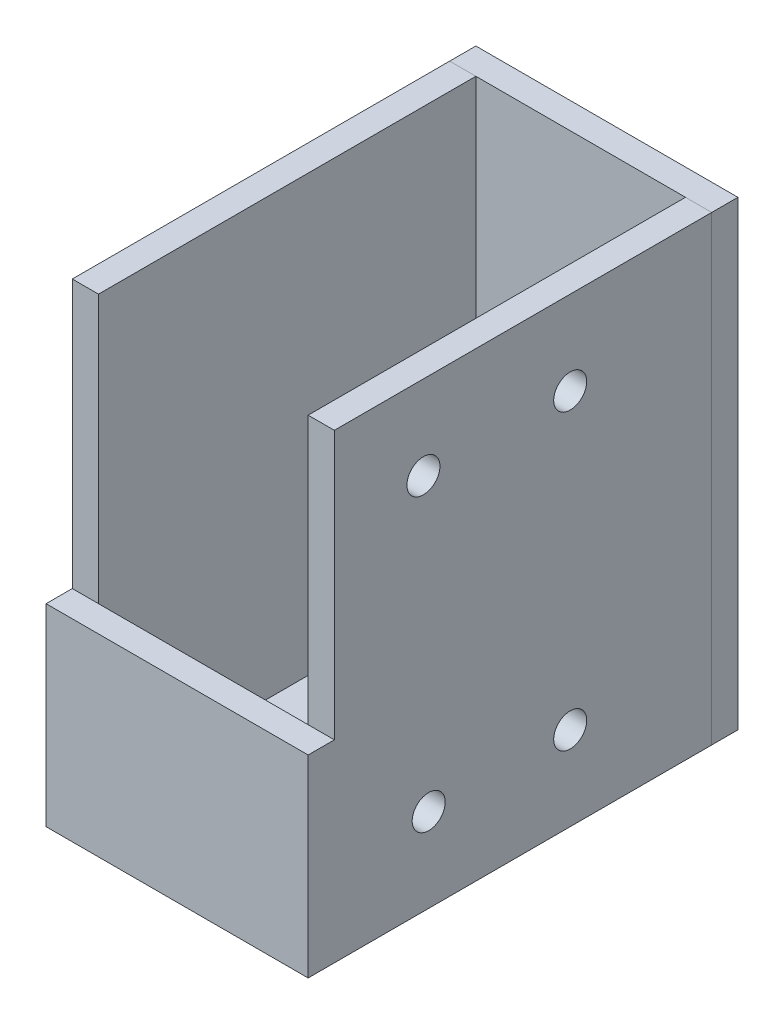
ISO-10303-21;
HEADER;
FILE_DESCRIPTION(('STEP AP214'),'2;1');
FILE_NAME('part.step','',(''),(''),'','','');
FILE_SCHEMA(('AUTOMOTIVE_DESIGN { 1 0 10303 214 1 1 1 1 }'));
ENDSEC;
DATA;
#1=APPLICATION_CONTEXT('core data for automotive mechanical design processes');
#2=APPLICATION_PROTOCOL_DEFINITION('international standard','automotive_design',2000,#1);
#3=PRODUCT_CONTEXT('',#1,'mechanical');
#4=PRODUCT('Part','Part','',(#3));
#5=PRODUCT_RELATED_PRODUCT_CATEGORY('part','',(#4));
#6=PRODUCT_DEFINITION_FORMATION('','',#4);
#7=PRODUCT_DEFINITION_CONTEXT('part definition',#1,'design');
#8=PRODUCT_DEFINITION('design','',#6,#7);
#9=PRODUCT_DEFINITION_SHAPE('','',#8);
#10=(LENGTH_UNIT() NAMED_UNIT(*) SI_UNIT(.MILLI.,.METRE.));
#11=(NAMED_UNIT(*) PLANE_ANGLE_UNIT() SI_UNIT($,.RADIAN.));
#12=(NAMED_UNIT(*) SI_UNIT($,.STERADIAN.) SOLID_ANGLE_UNIT());
#13=UNCERTAINTY_MEASURE_WITH_UNIT(LENGTH_MEASURE(1.E-05),#10,'distance_accuracy_value','');
#14=(GEOMETRIC_REPRESENTATION_CONTEXT(3) GLOBAL_UNCERTAINTY_ASSIGNED_CONTEXT((#13)) GLOBAL_UNIT_ASSIGNED_CONTEXT((#10,
#11,#12)) REPRESENTATION_CONTEXT('',''));
#15=CARTESIAN_POINT('',(0.,0.,0.));
#16=DIRECTION('',(0.,0.,1.));
#17=DIRECTION('',(1.,0.,0.));
#18=AXIS2_PLACEMENT_3D('',#15,#16,#17);
#19=CARTESIAN_POINT('',(0.,55.88,-3.175));
#20=DIRECTION('',(0.,-1.,0.));
#21=DIRECTION('',(0.,0.,-1.));
#22=AXIS2_PLACEMENT_3D('',#19,#20,#21);
#23=PLANE('',#22);
#24=DIRECTION('',(1.,0.,0.));
#25=VECTOR('',#24,1.);
#26=CARTESIAN_POINT('',(0.,55.88,0.));
#27=LINE('',#26,#25);
#28=CARTESIAN_POINT('',(0.,55.88,0.));
#29=VERTEX_POINT('',#28);
#30=CARTESIAN_POINT('',(31.75,55.88,0.));
#31=VERTEX_POINT('',#30);
#32=EDGE_CURVE('E118',#29,#31,#27,.T.);
#33=ORIENTED_EDGE('',*,*,#32,.T.);
#34=DIRECTION('',(0.,0.,1.));
#35=VECTOR('',#34,1.);
#36=CARTESIAN_POINT('',(31.75,55.88,-3.175));
#37=LINE('',#36,#35);
#38=CARTESIAN_POINT('',(31.75,55.88,-3.175));
#39=VERTEX_POINT('',#38);
#40=EDGE_CURVE('E12',#39,#31,#37,.T.);
#41=ORIENTED_EDGE('',*,*,#40,.F.);
#42=DIRECTION('',(1.,0.,0.));
#43=VECTOR('',#42,1.);
#44=CARTESIAN_POINT('',(0.,55.88,-3.175));
#45=LINE('',#44,#43);
#46=CARTESIAN_POINT('',(0.,55.88,-3.175));
#47=VERTEX_POINT('',#46);
#48=EDGE_CURVE('E106',#47,#39,#45,.T.);
#49=ORIENTED_EDGE('',*,*,#48,.F.);
#50=DIRECTION('',(0.,0.,1.));
#51=VECTOR('',#50,1.);
#52=CARTESIAN_POINT('',(0.,55.88,-3.175));
#53=LINE('',#52,#51);
#54=EDGE_CURVE('E114',#47,#29,#53,.T.);
#55=ORIENTED_EDGE('',*,*,#54,.T.);
#56=EDGE_LOOP('',(#33,#41,#49,#55));
#57=FACE_BOUND('',#56,.T.);
#58=ADVANCED_FACE('F55',(#57),#23,.F.);
#59=CARTESIAN_POINT('',(31.75,55.88,-3.175));
#60=DIRECTION('',(-1.,0.,0.));
#61=DIRECTION('',(0.,-1.,0.));
#62=AXIS2_PLACEMENT_3D('',#59,#60,#61);
#63=PLANE('',#62);
#64=DIRECTION('',(0.,-1.,0.));
#65=VECTOR('',#64,1.);
#66=CARTESIAN_POINT('',(31.75,55.88,0.));
#67=LINE('',#66,#65);
#68=CARTESIAN_POINT('',(31.75,0.,0.));
#69=VERTEX_POINT('',#68);
#70=EDGE_CURVE('E110',#31,#69,#67,.T.);
#71=ORIENTED_EDGE('',*,*,#70,.T.);
#72=DIRECTION('',(0.,0.,1.));
#73=VECTOR('',#72,1.);
#74=CARTESIAN_POINT('',(31.75,0.,-3.175));
#75=LINE('',#74,#73);
#76=CARTESIAN_POINT('',(31.75,0.,-3.175));
#77=VERTEX_POINT('',#76);
#78=EDGE_CURVE('E63',#77,#69,#75,.T.);
#79=ORIENTED_EDGE('',*,*,#78,.F.);
#80=DIRECTION('',(0.,-1.,0.));
#81=VECTOR('',#80,1.);
#82=CARTESIAN_POINT('',(31.75,55.88,-3.175));
#83=LINE('',#82,#81);
#84=EDGE_CURVE('E101',#39,#77,#83,.T.);
#85=ORIENTED_EDGE('',*,*,#84,.F.);
#86=ORIENTED_EDGE('',*,*,#40,.T.);
#87=EDGE_LOOP('',(#71,#79,#85,#86));
#88=FACE_BOUND('',#87,.T.);
#89=ADVANCED_FACE('F109',(#88),#63,.F.);
#90=CARTESIAN_POINT('',(31.75,0.,-3.175));
#91=DIRECTION('',(0.,1.,0.));
#92=DIRECTION('',(-1.,0.,0.));
#93=AXIS2_PLACEMENT_3D('',#90,#91,#92);
#94=PLANE('',#93);
#95=DIRECTION('',(-1.,0.,0.));
#96=VECTOR('',#95,1.);
#97=CARTESIAN_POINT('',(31.75,0.,0.));
#98=LINE('',#97,#96);
#99=CARTESIAN_POINT('',(0.,0.,0.));
#100=VERTEX_POINT('',#99);
#101=EDGE_CURVE('E88',#69,#100,#98,.T.);
#102=ORIENTED_EDGE('',*,*,#101,.T.);
#103=DIRECTION('',(0.,0.,1.));
#104=VECTOR('',#103,1.);
#105=CARTESIAN_POINT('',(0.,0.,-3.175));
#106=LINE('',#105,#104);
#107=CARTESIAN_POINT('',(0.,0.,-3.175));
#108=VERTEX_POINT('',#107);
#109=EDGE_CURVE('E111',#108,#100,#106,.T.);
#110=ORIENTED_EDGE('',*,*,#109,.F.);
#111=DIRECTION('',(-1.,0.,0.));
#112=VECTOR('',#111,1.);
#113=CARTESIAN_POINT('',(31.75,0.,-3.175));
#114=LINE('',#113,#112);
#115=EDGE_CURVE('E104',#77,#108,#114,.T.);
#116=ORIENTED_EDGE('',*,*,#115,.F.);
#117=ORIENTED_EDGE('',*,*,#78,.T.);
#118=EDGE_LOOP('',(#102,#110,#116,#117));
#119=FACE_BOUND('',#118,.T.);
#120=ADVANCED_FACE('F112',(#119),#94,.F.);
#121=CARTESIAN_POINT('',(0.,0.,-3.175));
#122=DIRECTION('',(1.,0.,0.));
#123=DIRECTION('',(0.,0.,-1.));
#124=AXIS2_PLACEMENT_3D('',#121,#122,#123);
#125=PLANE('',#124);
#126=DIRECTION('',(0.,1.,0.));
#127=VECTOR('',#126,1.);
#128=CARTESIAN_POINT('',(0.,0.,0.));
#129=LINE('',#128,#127);
#130=EDGE_CURVE('E94',#100,#29,#129,.T.);
#131=ORIENTED_EDGE('',*,*,#130,.T.);
#132=ORIENTED_EDGE('',*,*,#54,.F.);
#133=DIRECTION('',(0.,1.,0.));
#134=VECTOR('',#133,1.);
#135=CARTESIAN_POINT('',(0.,0.,-3.175));
#136=LINE('',#135,#134);
#137=EDGE_CURVE('E71',#108,#47,#136,.T.);
#138=ORIENTED_EDGE('',*,*,#137,.F.);
#139=ORIENTED_EDGE('',*,*,#109,.T.);
#140=EDGE_LOOP('',(#131,#132,#138,#139));
#141=FACE_BOUND('',#140,.T.);
#142=ADVANCED_FACE('F125',(#141),#125,.F.);
#143=CARTESIAN_POINT('',(0.,0.,-3.175));
#144=DIRECTION('',(0.,0.,-1.));
#145=DIRECTION('',(-1.,0.,0.));
#146=AXIS2_PLACEMENT_3D('',#143,#144,#145);
#147=PLANE('',#146);
#148=ORIENTED_EDGE('',*,*,#48,.T.);
#149=ORIENTED_EDGE('',*,*,#84,.T.);
#150=ORIENTED_EDGE('',*,*,#115,.T.);
#151=ORIENTED_EDGE('',*,*,#137,.T.);
#152=EDGE_LOOP('',(#148,#149,#150,#151));
#153=FACE_BOUND('',#152,.T.);
#154=ADVANCED_FACE('F102',(#153),#147,.T.);
#155=CARTESIAN_POINT('',(0.,0.,0.));
#156=DIRECTION('',(0.,0.,-1.));
#157=DIRECTION('',(-1.,0.,0.));
#158=AXIS2_PLACEMENT_3D('',#155,#156,#157);
#159=PLANE('',#158);
#160=ORIENTED_EDGE('',*,*,#32,.F.);
#161=ORIENTED_EDGE('',*,*,#130,.F.);
#162=ORIENTED_EDGE('',*,*,#101,.F.);
#163=ORIENTED_EDGE('',*,*,#70,.F.);
#164=EDGE_LOOP('',(#160,#161,#162,#163));
#165=FACE_BOUND('',#164,.T.);
#166=ADVANCED_FACE('F128',(#165),#159,.F.);
#167=CLOSED_SHELL('',(#58,#89,#120,#142,#154,#166));
#168=MANIFOLD_SOLID_BREP('B2',#167);
#169=CARTESIAN_POINT('',(0.,55.88,45.72));
#170=DIRECTION('',(0.,-1.,0.));
#171=DIRECTION('',(0.,0.,-1.));
#172=AXIS2_PLACEMENT_3D('',#169,#170,#171);
#173=PLANE('',#172);
#174=DIRECTION('',(-1.,0.,0.));
#175=VECTOR('',#174,1.);
#176=CARTESIAN_POINT('',(0.,55.88,45.72));
#177=LINE('',#176,#175);
#178=CARTESIAN_POINT('',(31.75,55.88,45.72));
#179=VERTEX_POINT('',#178);
#180=CARTESIAN_POINT('',(28.575,55.88,45.72));
#181=VERTEX_POINT('',#180);
#182=EDGE_CURVE('E313',#179,#181,#177,.T.);
#183=ORIENTED_EDGE('',*,*,#182,.F.);
#184=DIRECTION('',(0.,0.,-1.));
#185=VECTOR('',#184,1.);
#186=CARTESIAN_POINT('',(31.75,55.88,45.72));
#187=LINE('',#186,#185);
#188=CARTESIAN_POINT('',(31.75,55.88,0.));
#189=VERTEX_POINT('',#188);
#190=EDGE_CURVE('E188',#179,#189,#187,.T.);
#191=ORIENTED_EDGE('',*,*,#190,.T.);
#192=DIRECTION('',(-1.,0.,0.));
#193=VECTOR('',#192,1.);
#194=CARTESIAN_POINT('',(28.575,55.88,0.));
#195=LINE('',#194,#193);
#196=CARTESIAN_POINT('',(28.575,55.88,0.));
#197=VERTEX_POINT('',#196);
#198=EDGE_CURVE('E271',#189,#197,#195,.T.);
#199=ORIENTED_EDGE('',*,*,#198,.T.);
#200=DIRECTION('',(0.,0.,-1.));
#201=VECTOR('',#200,1.);
#202=CARTESIAN_POINT('',(28.575,55.88,45.72));
#203=LINE('',#202,#201);
#204=EDGE_CURVE('E303',#181,#197,#203,.T.);
#205=ORIENTED_EDGE('',*,*,#204,.F.);
#206=EDGE_LOOP('',(#183,#191,#199,#205));
#207=FACE_BOUND('',#206,.T.);
#208=ADVANCED_FACE('F179',(#207),#173,.F.);
#209=CARTESIAN_POINT('',(3.175,55.88,45.72));
#210=VERTEX_POINT('',#209);
#211=CARTESIAN_POINT('',(0.,55.88,45.72));
#212=VERTEX_POINT('',#211);
#213=EDGE_CURVE('E392',#210,#212,#177,.T.);
#214=ORIENTED_EDGE('',*,*,#213,.F.);
#215=DIRECTION('',(0.,0.,-1.));
#216=VECTOR('',#215,1.);
#217=CARTESIAN_POINT('',(3.175,55.88,45.72));
#218=LINE('',#217,#216);
#219=CARTESIAN_POINT('',(3.175,55.88,0.));
#220=VERTEX_POINT('',#219);
#221=EDGE_CURVE('E293',#210,#220,#218,.T.);
#222=ORIENTED_EDGE('',*,*,#221,.T.);
#223=DIRECTION('',(-1.,0.,0.));
#224=VECTOR('',#223,1.);
#225=CARTESIAN_POINT('',(0.,55.88,0.));
#226=LINE('',#225,#224);
#227=CARTESIAN_POINT('',(0.,55.88,0.));
#228=VERTEX_POINT('',#227);
#229=EDGE_CURVE('E251',#220,#228,#226,.T.);
#230=ORIENTED_EDGE('',*,*,#229,.T.);
#231=DIRECTION('',(0.,0.,-1.));
#232=VECTOR('',#231,1.);
#233=CARTESIAN_POINT('',(0.,55.88,45.72));
#234=LINE('',#233,#232);
#235=EDGE_CURVE('E244',#212,#228,#234,.T.);
#236=ORIENTED_EDGE('',*,*,#235,.F.);
#237=EDGE_LOOP('',(#214,#222,#230,#236));
#238=FACE_BOUND('',#237,.T.);
#239=ADVANCED_FACE('F446',(#238),#173,.F.);
#240=CARTESIAN_POINT('',(31.75,0.,45.72));
#241=DIRECTION('',(0.,1.,0.));
#242=DIRECTION('',(-1.,0.,0.));
#243=AXIS2_PLACEMENT_3D('',#240,#241,#242);
#244=PLANE('',#243);
#245=DIRECTION('',(1.,0.,0.));
#246=VECTOR('',#245,1.);
#247=CARTESIAN_POINT('',(31.75,0.,0.));
#248=LINE('',#247,#246);
#249=CARTESIAN_POINT('',(0.,0.,0.));
#250=VERTEX_POINT('',#249);
#251=CARTESIAN_POINT('',(31.75,0.,0.));
#252=VERTEX_POINT('',#251);
#253=EDGE_CURVE('E256',#250,#252,#248,.T.);
#254=ORIENTED_EDGE('',*,*,#253,.T.);
#255=DIRECTION('',(0.,0.,-1.));
#256=VECTOR('',#255,1.);
#257=CARTESIAN_POINT('',(31.75,0.,45.72));
#258=LINE('',#257,#256);
#259=CARTESIAN_POINT('',(31.75,0.,48.895));
#260=VERTEX_POINT('',#259);
#261=EDGE_CURVE('E53',#260,#252,#258,.T.);
#262=ORIENTED_EDGE('',*,*,#261,.F.);
#263=DIRECTION('',(1.,0.,0.));
#264=VECTOR('',#263,1.);
#265=CARTESIAN_POINT('',(0.,0.,48.895));
#266=LINE('',#265,#264);
#267=CARTESIAN_POINT('',(0.,0.,48.895));
#268=VERTEX_POINT('',#267);
#269=EDGE_CURVE('E258',#268,#260,#266,.T.);
#270=ORIENTED_EDGE('',*,*,#269,.F.);
#271=DIRECTION('',(0.,0.,-1.));
#272=VECTOR('',#271,1.);
#273=CARTESIAN_POINT('',(0.,0.,45.72));
#274=LINE('',#273,#272);
#275=EDGE_CURVE('E240',#268,#250,#274,.T.);
#276=ORIENTED_EDGE('',*,*,#275,.T.);
#277=EDGE_LOOP('',(#254,#262,#270,#276));
#278=FACE_BOUND('',#277,.T.);
#279=ADVANCED_FACE('F181',(#278),#244,.F.);
#280=CARTESIAN_POINT('',(31.75,55.88,45.72));
#281=DIRECTION('',(-1.,0.,0.));
#282=DIRECTION('',(0.,-1.,0.));
#283=AXIS2_PLACEMENT_3D('',#280,#281,#282);
#284=PLANE('',#283);
#285=CARTESIAN_POINT('',(31.75,45.72,34.925));
#286=DIRECTION('',(1.,0.,0.));
#287=DIRECTION('',(0.,1.,0.));
#288=AXIS2_PLACEMENT_3D('',#285,#286,#287);
#289=CIRCLE('',#288,2.);
#290=CARTESIAN_POINT('',(31.75,47.72,34.925));
#291=VERTEX_POINT('',#290);
#292=EDGE_CURVE('E357',#291,#291,#289,.T.);
#293=ORIENTED_EDGE('',*,*,#292,.F.);
#294=EDGE_LOOP('',(#293));
#295=FACE_BOUND('',#294,.T.);
#296=CARTESIAN_POINT('',(31.75,10.16,34.29));
#297=DIRECTION('',(1.,0.,0.));
#298=DIRECTION('',(0.,1.,0.));
#299=AXIS2_PLACEMENT_3D('',#296,#297,#298);
#300=CIRCLE('',#299,2.);
#301=CARTESIAN_POINT('',(31.75,12.16,34.29));
#302=VERTEX_POINT('',#301);
#303=EDGE_CURVE('E366',#302,#302,#300,.T.);
#304=ORIENTED_EDGE('',*,*,#303,.F.);
#305=EDGE_LOOP('',(#304));
#306=FACE_BOUND('',#305,.T.);
#307=CARTESIAN_POINT('',(31.75,10.16,17.145));
#308=DIRECTION('',(1.,0.,0.));
#309=DIRECTION('',(0.,1.,0.));
#310=AXIS2_PLACEMENT_3D('',#307,#308,#309);
#311=CIRCLE('',#310,2.);
#312=CARTESIAN_POINT('',(31.75,12.16,17.145));
#313=VERTEX_POINT('',#312);
#314=EDGE_CURVE('E349',#313,#313,#311,.T.);
#315=ORIENTED_EDGE('',*,*,#314,.F.);
#316=EDGE_LOOP('',(#315));
#317=FACE_BOUND('',#316,.T.);
#318=CARTESIAN_POINT('',(31.75,45.72,17.145));
#319=DIRECTION('',(1.,0.,0.));
#320=DIRECTION('',(0.,1.,0.));
#321=AXIS2_PLACEMENT_3D('',#318,#319,#320);
#322=CIRCLE('',#321,2.);
#323=CARTESIAN_POINT('',(31.75,47.72,17.145));
#324=VERTEX_POINT('',#323);
#325=EDGE_CURVE('E345',#324,#324,#322,.T.);
#326=ORIENTED_EDGE('',*,*,#325,.F.);
#327=EDGE_LOOP('',(#326));
#328=FACE_BOUND('',#327,.T.);
#329=DIRECTION('',(0.,1.,0.));
#330=VECTOR('',#329,1.);
#331=CARTESIAN_POINT('',(31.75,55.88,45.72));
#332=LINE('',#331,#330);
#333=CARTESIAN_POINT('',(31.75,23.4008782856742,45.72));
#334=VERTEX_POINT('',#333);
#335=EDGE_CURVE('E393',#334,#179,#332,.T.);
#336=ORIENTED_EDGE('',*,*,#335,.F.);
#337=DIRECTION('',(0.,0.,1.));
#338=VECTOR('',#337,1.);
#339=CARTESIAN_POINT('',(31.75,23.4008782856742,45.72));
#340=LINE('',#339,#338);
#341=CARTESIAN_POINT('',(31.75,23.4008782856742,48.895));
#342=VERTEX_POINT('',#341);
#343=EDGE_CURVE('E380',#334,#342,#340,.T.);
#344=ORIENTED_EDGE('',*,*,#343,.T.);
#345=DIRECTION('',(0.,1.,0.));
#346=VECTOR('',#345,1.);
#347=CARTESIAN_POINT('',(31.75,0.,48.895));
#348=LINE('',#347,#346);
#349=EDGE_CURVE('E267',#260,#342,#348,.T.);
#350=ORIENTED_EDGE('',*,*,#349,.F.);
#351=ORIENTED_EDGE('',*,*,#261,.T.);
#352=DIRECTION('',(0.,1.,0.));
#353=VECTOR('',#352,1.);
#354=CARTESIAN_POINT('',(31.75,55.88,0.));
#355=LINE('',#354,#353);
#356=EDGE_CURVE('E265',#252,#189,#355,.T.);
#357=ORIENTED_EDGE('',*,*,#356,.T.);
#358=ORIENTED_EDGE('',*,*,#190,.F.);
#359=EDGE_LOOP('',(#336,#344,#350,#351,#357,#358));
#360=FACE_BOUND('',#359,.T.);
#361=ADVANCED_FACE('F316',(#295,#306,#317,#328,#360),#284,.F.);
#362=CARTESIAN_POINT('',(28.575,3.175,45.72));
#363=DIRECTION('',(1.,0.,0.));
#364=DIRECTION('',(0.,0.,-1.));
#365=AXIS2_PLACEMENT_3D('',#362,#363,#364);
#366=PLANE('',#365);
#367=CARTESIAN_POINT('',(28.575,45.72,34.925));
#368=DIRECTION('',(1.,0.,0.));
#369=DIRECTION('',(0.,1.,0.));
#370=AXIS2_PLACEMENT_3D('',#367,#368,#369);
#371=CIRCLE('',#370,2.);
#372=CARTESIAN_POINT('',(28.575,47.72,34.925));
#373=VERTEX_POINT('',#372);
#374=EDGE_CURVE('E353',#373,#373,#371,.T.);
#375=ORIENTED_EDGE('',*,*,#374,.T.);
#376=EDGE_LOOP('',(#375));
#377=FACE_BOUND('',#376,.T.);
#378=CARTESIAN_POINT('',(28.575,10.16,34.29));
#379=DIRECTION('',(1.,0.,0.));
#380=DIRECTION('',(0.,1.,0.));
#381=AXIS2_PLACEMENT_3D('',#378,#379,#380);
#382=CIRCLE('',#381,2.);
#383=CARTESIAN_POINT('',(28.575,12.16,34.29));
#384=VERTEX_POINT('',#383);
#385=EDGE_CURVE('E362',#384,#384,#382,.T.);
#386=ORIENTED_EDGE('',*,*,#385,.T.);
#387=EDGE_LOOP('',(#386));
#388=FACE_BOUND('',#387,.T.);
#389=CARTESIAN_POINT('',(28.575,10.16,17.145));
#390=DIRECTION('',(1.,0.,0.));
#391=DIRECTION('',(0.,1.,0.));
#392=AXIS2_PLACEMENT_3D('',#389,#390,#391);
#393=CIRCLE('',#392,2.);
#394=CARTESIAN_POINT('',(28.575,12.16,17.145));
#395=VERTEX_POINT('',#394);
#396=EDGE_CURVE('E370',#395,#395,#393,.T.);
#397=ORIENTED_EDGE('',*,*,#396,.T.);
#398=EDGE_LOOP('',(#397));
#399=FACE_BOUND('',#398,.T.);
#400=CARTESIAN_POINT('',(28.575,45.72,17.145));
#401=DIRECTION('',(1.,0.,0.));
#402=DIRECTION('',(0.,1.,0.));
#403=AXIS2_PLACEMENT_3D('',#400,#401,#402);
#404=CIRCLE('',#403,2.);
#405=CARTESIAN_POINT('',(28.575,47.72,17.145));
#406=VERTEX_POINT('',#405);
#407=EDGE_CURVE('E344',#406,#406,#404,.T.);
#408=ORIENTED_EDGE('',*,*,#407,.T.);
#409=EDGE_LOOP('',(#408));
#410=FACE_BOUND('',#409,.T.);
#411=DIRECTION('',(0.,-1.,0.));
#412=VECTOR('',#411,1.);
#413=CARTESIAN_POINT('',(28.575,3.175,0.));
#414=LINE('',#413,#412);
#415=CARTESIAN_POINT('',(28.575,3.175,0.));
#416=VERTEX_POINT('',#415);
#417=EDGE_CURVE('E280',#197,#416,#414,.T.);
#418=ORIENTED_EDGE('',*,*,#417,.T.);
#419=DIRECTION('',(0.,0.,-1.));
#420=VECTOR('',#419,1.);
#421=CARTESIAN_POINT('',(28.575,3.175,45.72));
#422=LINE('',#421,#420);
#423=CARTESIAN_POINT('',(28.575,3.175,45.72));
#424=VERTEX_POINT('',#423);
#425=EDGE_CURVE('E299',#424,#416,#422,.T.);
#426=ORIENTED_EDGE('',*,*,#425,.F.);
#427=DIRECTION('',(0.,-1.,0.));
#428=VECTOR('',#427,1.);
#429=CARTESIAN_POINT('',(28.575,3.175,45.72));
#430=LINE('',#429,#428);
#431=CARTESIAN_POINT('',(28.575,23.4008782856742,45.72));
#432=VERTEX_POINT('',#431);
#433=EDGE_CURVE('E250',#432,#424,#430,.T.);
#434=ORIENTED_EDGE('',*,*,#433,.F.);
#435=EDGE_CURVE('E332',#181,#432,#430,.T.);
#436=ORIENTED_EDGE('',*,*,#435,.F.);
#437=ORIENTED_EDGE('',*,*,#204,.T.);
#438=EDGE_LOOP('',(#418,#426,#434,#436,#437));
#439=FACE_BOUND('',#438,.T.);
#440=ADVANCED_FACE('F323',(#377,#388,#399,#410,#439),#366,.F.);
#441=CARTESIAN_POINT('',(3.17500000000001,3.175,45.72));
#442=DIRECTION('',(0.,-1.,0.));
#443=DIRECTION('',(0.,0.,-1.));
#444=AXIS2_PLACEMENT_3D('',#441,#442,#443);
#445=PLANE('',#444);
#446=DIRECTION('',(-1.,0.,0.));
#447=VECTOR('',#446,1.);
#448=CARTESIAN_POINT('',(3.17500000000001,3.175,0.));
#449=LINE('',#448,#447);
#450=CARTESIAN_POINT('',(3.17500000000001,3.175,0.));
#451=VERTEX_POINT('',#450);
#452=EDGE_CURVE('E283',#416,#451,#449,.T.);
#453=ORIENTED_EDGE('',*,*,#452,.T.);
#454=DIRECTION('',(0.,0.,-1.));
#455=VECTOR('',#454,1.);
#456=CARTESIAN_POINT('',(3.17500000000001,3.175,45.72));
#457=LINE('',#456,#455);
#458=CARTESIAN_POINT('',(3.17500000000001,3.175,45.72));
#459=VERTEX_POINT('',#458);
#460=EDGE_CURVE('E204',#459,#451,#457,.T.);
#461=ORIENTED_EDGE('',*,*,#460,.F.);
#462=DIRECTION('',(-1.,0.,0.));
#463=VECTOR('',#462,1.);
#464=CARTESIAN_POINT('',(3.17500000000001,3.175,45.72));
#465=LINE('',#464,#463);
#466=EDGE_CURVE('E328',#424,#459,#465,.T.);
#467=ORIENTED_EDGE('',*,*,#466,.F.);
#468=ORIENTED_EDGE('',*,*,#425,.T.);
#469=EDGE_LOOP('',(#453,#461,#467,#468));
#470=FACE_BOUND('',#469,.T.);
#471=ADVANCED_FACE('F326',(#470),#445,.F.);
#472=CARTESIAN_POINT('',(3.175,55.88,45.72));
#473=DIRECTION('',(-1.,0.,0.));
#474=DIRECTION('',(0.,-1.,0.));
#475=AXIS2_PLACEMENT_3D('',#472,#473,#474);
#476=PLANE('',#475);
#477=DIRECTION('',(0.,1.,0.));
#478=VECTOR('',#477,1.);
#479=CARTESIAN_POINT('',(3.175,55.88,0.));
#480=LINE('',#479,#478);
#481=EDGE_CURVE('E286',#451,#220,#480,.T.);
#482=ORIENTED_EDGE('',*,*,#481,.T.);
#483=ORIENTED_EDGE('',*,*,#221,.F.);
#484=DIRECTION('',(0.,1.,0.));
#485=VECTOR('',#484,1.);
#486=CARTESIAN_POINT('',(3.175,55.88,45.72));
#487=LINE('',#486,#485);
#488=CARTESIAN_POINT('',(3.175,23.4008782856742,45.72));
#489=VERTEX_POINT('',#488);
#490=EDGE_CURVE('E358',#489,#210,#487,.T.);
#491=ORIENTED_EDGE('',*,*,#490,.F.);
#492=DIRECTION('',(0.,1.,0.));
#493=VECTOR('',#492,1.);
#494=CARTESIAN_POINT('',(3.175,55.88,45.72));
#495=LINE('',#494,#493);
#496=EDGE_CURVE('E260',#459,#489,#495,.T.);
#497=ORIENTED_EDGE('',*,*,#496,.F.);
#498=ORIENTED_EDGE('',*,*,#460,.T.);
#499=EDGE_LOOP('',(#482,#483,#491,#497,#498));
#500=FACE_BOUND('',#499,.T.);
#501=ADVANCED_FACE('F444',(#500),#476,.F.);
#502=CARTESIAN_POINT('',(0.,0.,45.72));
#503=DIRECTION('',(1.,0.,0.));
#504=DIRECTION('',(0.,0.,-1.));
#505=AXIS2_PLACEMENT_3D('',#502,#503,#504);
#506=PLANE('',#505);
#507=DIRECTION('',(0.,-1.,0.));
#508=VECTOR('',#507,1.);
#509=CARTESIAN_POINT('',(0.,55.88,48.895));
#510=LINE('',#509,#508);
#511=CARTESIAN_POINT('',(0.,23.4008782856742,48.895));
#512=VERTEX_POINT('',#511);
#513=EDGE_CURVE('E340',#512,#268,#510,.T.);
#514=ORIENTED_EDGE('',*,*,#513,.F.);
#515=DIRECTION('',(0.,0.,1.));
#516=VECTOR('',#515,1.);
#517=CARTESIAN_POINT('',(0.,23.4008782856742,45.72));
#518=LINE('',#517,#516);
#519=CARTESIAN_POINT('',(0.,23.4008782856742,45.72));
#520=VERTEX_POINT('',#519);
#521=EDGE_CURVE('E195',#520,#512,#518,.T.);
#522=ORIENTED_EDGE('',*,*,#521,.F.);
#523=DIRECTION('',(0.,-1.,0.));
#524=VECTOR('',#523,1.);
#525=CARTESIAN_POINT('',(0.,55.88,45.72));
#526=LINE('',#525,#524);
#527=EDGE_CURVE('E389',#212,#520,#526,.T.);
#528=ORIENTED_EDGE('',*,*,#527,.F.);
#529=ORIENTED_EDGE('',*,*,#235,.T.);
#530=DIRECTION('',(0.,-1.,0.));
#531=VECTOR('',#530,1.);
#532=CARTESIAN_POINT('',(0.,0.,0.));
#533=LINE('',#532,#531);
#534=EDGE_CURVE('E235',#228,#250,#533,.T.);
#535=ORIENTED_EDGE('',*,*,#534,.T.);
#536=ORIENTED_EDGE('',*,*,#275,.F.);
#537=EDGE_LOOP('',(#514,#522,#528,#529,#535,#536));
#538=FACE_BOUND('',#537,.T.);
#539=ADVANCED_FACE('F238',(#538),#506,.F.);
#540=CARTESIAN_POINT('',(0.,0.,0.));
#541=DIRECTION('',(0.,0.,-1.));
#542=DIRECTION('',(-1.,0.,0.));
#543=AXIS2_PLACEMENT_3D('',#540,#541,#542);
#544=PLANE('',#543);
#545=ORIENTED_EDGE('',*,*,#253,.F.);
#546=ORIENTED_EDGE('',*,*,#534,.F.);
#547=ORIENTED_EDGE('',*,*,#229,.F.);
#548=ORIENTED_EDGE('',*,*,#481,.F.);
#549=ORIENTED_EDGE('',*,*,#452,.F.);
#550=ORIENTED_EDGE('',*,*,#417,.F.);
#551=ORIENTED_EDGE('',*,*,#198,.F.);
#552=ORIENTED_EDGE('',*,*,#356,.F.);
#553=EDGE_LOOP('',(#545,#546,#547,#548,#549,#550,#551,#552));
#554=FACE_BOUND('',#553,.T.);
#555=ADVANCED_FACE('F262',(#554),#544,.T.);
#556=CARTESIAN_POINT('',(0.,0.,45.72));
#557=DIRECTION('',(0.,0.,1.));
#558=DIRECTION('',(1.,0.,0.));
#559=AXIS2_PLACEMENT_3D('',#556,#557,#558);
#560=PLANE('',#559);
#561=ORIENTED_EDGE('',*,*,#496,.T.);
#562=DIRECTION('',(1.,0.,0.));
#563=VECTOR('',#562,1.);
#564=CARTESIAN_POINT('',(0.,23.4008782856742,45.72));
#565=LINE('',#564,#563);
#566=EDGE_CURVE('E401',#489,#432,#565,.T.);
#567=ORIENTED_EDGE('',*,*,#566,.T.);
#568=ORIENTED_EDGE('',*,*,#433,.T.);
#569=ORIENTED_EDGE('',*,*,#466,.T.);
#570=EDGE_LOOP('',(#561,#567,#568,#569));
#571=FACE_BOUND('',#570,.T.);
#572=ADVANCED_FACE('F418',(#571),#560,.F.);
#573=CARTESIAN_POINT('',(0.,0.,48.895));
#574=DIRECTION('',(0.,0.,1.));
#575=DIRECTION('',(1.,0.,0.));
#576=AXIS2_PLACEMENT_3D('',#573,#574,#575);
#577=PLANE('',#576);
#578=DIRECTION('',(1.,0.,0.));
#579=VECTOR('',#578,1.);
#580=CARTESIAN_POINT('',(0.,23.4008782856742,48.895));
#581=LINE('',#580,#579);
#582=EDGE_CURVE('E386',#512,#342,#581,.T.);
#583=ORIENTED_EDGE('',*,*,#582,.F.);
#584=ORIENTED_EDGE('',*,*,#513,.T.);
#585=ORIENTED_EDGE('',*,*,#269,.T.);
#586=ORIENTED_EDGE('',*,*,#349,.T.);
#587=EDGE_LOOP('',(#583,#584,#585,#586));
#588=FACE_BOUND('',#587,.T.);
#589=ADVANCED_FACE('F438',(#588),#577,.T.);
#590=CARTESIAN_POINT('',(28.575,45.72,17.145));
#591=DIRECTION('',(1.,0.,0.));
#592=DIRECTION('',(0.,1.,0.));
#593=AXIS2_PLACEMENT_3D('',#590,#591,#592);
#594=CYLINDRICAL_SURFACE('',#593,2.);
#595=ORIENTED_EDGE('',*,*,#407,.F.);
#596=EDGE_LOOP('',(#595));
#597=FACE_BOUND('',#596,.T.);
#598=ORIENTED_EDGE('',*,*,#325,.T.);
#599=EDGE_LOOP('',(#598));
#600=FACE_BOUND('',#599,.T.);
#601=ADVANCED_FACE('F475',(#597,#600),#594,.F.);
#602=CARTESIAN_POINT('',(28.575,10.16,17.145));
#603=DIRECTION('',(1.,0.,0.));
#604=DIRECTION('',(0.,1.,0.));
#605=AXIS2_PLACEMENT_3D('',#602,#603,#604);
#606=CYLINDRICAL_SURFACE('',#605,2.);
#607=ORIENTED_EDGE('',*,*,#396,.F.);
#608=EDGE_LOOP('',(#607));
#609=FACE_BOUND('',#608,.T.);
#610=ORIENTED_EDGE('',*,*,#314,.T.);
#611=EDGE_LOOP('',(#610));
#612=FACE_BOUND('',#611,.T.);
#613=ADVANCED_FACE('F477',(#609,#612),#606,.F.);
#614=CARTESIAN_POINT('',(28.575,10.16,34.29));
#615=DIRECTION('',(1.,0.,0.));
#616=DIRECTION('',(0.,1.,0.));
#617=AXIS2_PLACEMENT_3D('',#614,#615,#616);
#618=CYLINDRICAL_SURFACE('',#617,2.);
#619=ORIENTED_EDGE('',*,*,#385,.F.);
#620=EDGE_LOOP('',(#619));
#621=FACE_BOUND('',#620,.T.);
#622=ORIENTED_EDGE('',*,*,#303,.T.);
#623=EDGE_LOOP('',(#622));
#624=FACE_BOUND('',#623,.T.);
#625=ADVANCED_FACE('F483',(#621,#624),#618,.F.);
#626=CARTESIAN_POINT('',(28.575,45.72,34.925));
#627=DIRECTION('',(1.,0.,0.));
#628=DIRECTION('',(0.,1.,0.));
#629=AXIS2_PLACEMENT_3D('',#626,#627,#628);
#630=CYLINDRICAL_SURFACE('',#629,2.);
#631=ORIENTED_EDGE('',*,*,#374,.F.);
#632=EDGE_LOOP('',(#631));
#633=FACE_BOUND('',#632,.T.);
#634=ORIENTED_EDGE('',*,*,#292,.T.);
#635=EDGE_LOOP('',(#634));
#636=FACE_BOUND('',#635,.T.);
#637=ADVANCED_FACE('F490',(#633,#636),#630,.F.);
#638=CARTESIAN_POINT('',(0.,0.,45.72));
#639=DIRECTION('',(0.,0.,1.));
#640=DIRECTION('',(1.,0.,0.));
#641=AXIS2_PLACEMENT_3D('',#638,#639,#640);
#642=PLANE('',#641);
#643=ORIENTED_EDGE('',*,*,#435,.T.);
#644=EDGE_CURVE('E402',#432,#334,#565,.T.);
#645=ORIENTED_EDGE('',*,*,#644,.T.);
#646=ORIENTED_EDGE('',*,*,#335,.T.);
#647=ORIENTED_EDGE('',*,*,#182,.T.);
#648=EDGE_LOOP('',(#643,#645,#646,#647));
#649=FACE_BOUND('',#648,.T.);
#650=ADVANCED_FACE('F426',(#649),#642,.T.);
#651=ORIENTED_EDGE('',*,*,#490,.T.);
#652=ORIENTED_EDGE('',*,*,#213,.T.);
#653=ORIENTED_EDGE('',*,*,#527,.T.);
#654=EDGE_CURVE('E397',#520,#489,#565,.T.);
#655=ORIENTED_EDGE('',*,*,#654,.T.);
#656=EDGE_LOOP('',(#651,#652,#653,#655));
#657=FACE_BOUND('',#656,.T.);
#658=ADVANCED_FACE('F440',(#657),#642,.T.);
#659=CARTESIAN_POINT('',(0.,23.4008782856742,45.72));
#660=DIRECTION('',(0.,-1.,0.));
#661=DIRECTION('',(0.,0.,-1.));
#662=AXIS2_PLACEMENT_3D('',#659,#660,#661);
#663=PLANE('',#662);
#664=ORIENTED_EDGE('',*,*,#582,.T.);
#665=ORIENTED_EDGE('',*,*,#343,.F.);
#666=ORIENTED_EDGE('',*,*,#644,.F.);
#667=ORIENTED_EDGE('',*,*,#566,.F.);
#668=ORIENTED_EDGE('',*,*,#654,.F.);
#669=ORIENTED_EDGE('',*,*,#521,.T.);
#670=EDGE_LOOP('',(#664,#665,#666,#667,#668,#669));
#671=FACE_BOUND('',#670,.T.);
#672=ADVANCED_FACE('F427',(#671),#663,.F.);
#673=CLOSED_SHELL('',(#208,#239,#279,#361,#440,#471,#501,#539,#555,#572,#589,#601,#613,#625,
#637,#650,#658,#672));
#674=MANIFOLD_SOLID_BREP('B6',#673);
#675=ADVANCED_BREP_SHAPE_REPRESENTATION('',(#18,#168,#674),#14);
#676=SHAPE_DEFINITION_REPRESENTATION(#9,#675);
ENDSEC;
END-ISO-10303-21;
